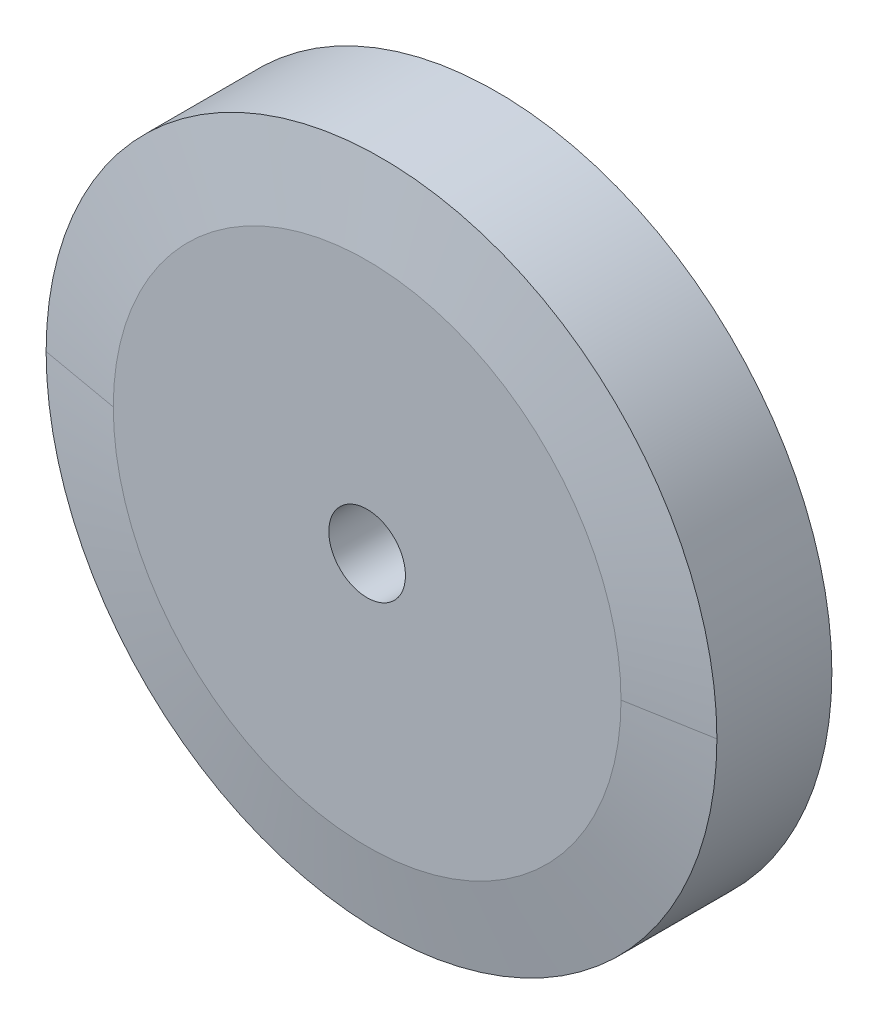
ISO-10303-21;
HEADER;
FILE_DESCRIPTION(('STEP AP214'),'2;1');
FILE_NAME('part.step','',(''),(''),'','','');
FILE_SCHEMA(('AUTOMOTIVE_DESIGN { 1 0 10303 214 1 1 1 1 }'));
ENDSEC;
DATA;
#1=APPLICATION_CONTEXT('core data for automotive mechanical design processes');
#2=APPLICATION_PROTOCOL_DEFINITION('international standard','automotive_design',2000,#1);
#3=PRODUCT_CONTEXT('',#1,'mechanical');
#4=PRODUCT('Part','Part','',(#3));
#5=PRODUCT_RELATED_PRODUCT_CATEGORY('part','',(#4));
#6=PRODUCT_DEFINITION_FORMATION('','',#4);
#7=PRODUCT_DEFINITION_CONTEXT('part definition',#1,'design');
#8=PRODUCT_DEFINITION('design','',#6,#7);
#9=PRODUCT_DEFINITION_SHAPE('','',#8);
#10=(LENGTH_UNIT() NAMED_UNIT(*) SI_UNIT(.MILLI.,.METRE.));
#11=(NAMED_UNIT(*) PLANE_ANGLE_UNIT() SI_UNIT($,.RADIAN.));
#12=(NAMED_UNIT(*) SI_UNIT($,.STERADIAN.) SOLID_ANGLE_UNIT());
#13=UNCERTAINTY_MEASURE_WITH_UNIT(LENGTH_MEASURE(1.E-05),#10,'distance_accuracy_value','');
#14=(GEOMETRIC_REPRESENTATION_CONTEXT(3) GLOBAL_UNCERTAINTY_ASSIGNED_CONTEXT((#13)) GLOBAL_UNIT_ASSIGNED_CONTEXT((#10,
#11,#12)) REPRESENTATION_CONTEXT('',''));
#15=CARTESIAN_POINT('',(0.,0.,0.));
#16=DIRECTION('',(0.,0.,1.));
#17=DIRECTION('',(1.,0.,0.));
#18=AXIS2_PLACEMENT_3D('',#15,#16,#17);
#19=CARTESIAN_POINT('',(0.,0.,15.));
#20=DIRECTION('',(0.,0.,-1.));
#21=DIRECTION('',(-1.,0.,0.));
#22=AXIS2_PLACEMENT_3D('',#19,#20,#21);
#23=CYLINDRICAL_SURFACE('',#22,35.);
#24=CARTESIAN_POINT('',(0.,0.,13.5));
#25=DIRECTION('',(0.,0.,-1.));
#26=DIRECTION('',(-1.,0.,0.));
#27=AXIS2_PLACEMENT_3D('',#24,#25,#26);
#28=CIRCLE('',#27,35.);
#29=CARTESIAN_POINT('',(-35.,0.,13.5));
#30=VERTEX_POINT('',#29);
#31=CARTESIAN_POINT('',(35.,0.,13.5));
#32=VERTEX_POINT('',#31);
#33=EDGE_CURVE('E81',#30,#32,#28,.T.);
#34=ORIENTED_EDGE('',*,*,#33,.T.);
#35=CARTESIAN_POINT('',(0.,0.,13.5));
#36=DIRECTION('',(0.,0.,-1.));
#37=DIRECTION('',(1.,0.,0.));
#38=AXIS2_PLACEMENT_3D('',#35,#36,#37);
#39=CIRCLE('',#38,35.);
#40=EDGE_CURVE('E90',#32,#30,#39,.T.);
#41=ORIENTED_EDGE('',*,*,#40,.T.);
#42=EDGE_LOOP('',(#34,#41));
#43=FACE_BOUND('',#42,.T.);
#44=CARTESIAN_POINT('',(0.,0.,1.5));
#45=DIRECTION('',(0.,0.,-1.));
#46=DIRECTION('',(-1.,0.,0.));
#47=AXIS2_PLACEMENT_3D('',#44,#45,#46);
#48=CIRCLE('',#47,35.);
#49=CARTESIAN_POINT('',(-35.,0.,1.5));
#50=VERTEX_POINT('',#49);
#51=CARTESIAN_POINT('',(35.,0.,1.5));
#52=VERTEX_POINT('',#51);
#53=EDGE_CURVE('E107',#50,#52,#48,.T.);
#54=ORIENTED_EDGE('',*,*,#53,.F.);
#55=CARTESIAN_POINT('',(0.,0.,1.5));
#56=DIRECTION('',(0.,0.,-1.));
#57=DIRECTION('',(1.,0.,0.));
#58=AXIS2_PLACEMENT_3D('',#55,#56,#57);
#59=CIRCLE('',#58,35.);
#60=EDGE_CURVE('E112',#52,#50,#59,.T.);
#61=ORIENTED_EDGE('',*,*,#60,.F.);
#62=EDGE_LOOP('',(#54,#61));
#63=FACE_BOUND('',#62,.T.);
#64=ADVANCED_FACE('F43',(#43,#63),#23,.T.);
#65=CARTESIAN_POINT('',(0.,0.,15.));
#66=DIRECTION('',(0.,0.,1.));
#67=DIRECTION('',(1.,0.,0.));
#68=AXIS2_PLACEMENT_3D('',#65,#66,#67);
#69=PLANE('',#68);
#70=CARTESIAN_POINT('',(0.,0.,15.));
#71=DIRECTION('',(0.,0.,-1.));
#72=DIRECTION('',(1.,0.,0.));
#73=AXIS2_PLACEMENT_3D('',#70,#71,#72);
#74=CIRCLE('',#73,26.4930772705736);
#75=CARTESIAN_POINT('',(26.4930772705736,0.,15.));
#76=VERTEX_POINT('',#75);
#77=CARTESIAN_POINT('',(-26.4930772705736,0.,15.));
#78=VERTEX_POINT('',#77);
#79=EDGE_CURVE('E92',#76,#78,#74,.T.);
#80=ORIENTED_EDGE('',*,*,#79,.F.);
#81=CARTESIAN_POINT('',(0.,0.,15.));
#82=DIRECTION('',(0.,0.,-1.));
#83=DIRECTION('',(-1.,0.,0.));
#84=AXIS2_PLACEMENT_3D('',#81,#82,#83);
#85=CIRCLE('',#84,26.4930772705736);
#86=EDGE_CURVE('E86',#78,#76,#85,.T.);
#87=ORIENTED_EDGE('',*,*,#86,.F.);
#88=EDGE_LOOP('',(#80,#87));
#89=FACE_BOUND('',#88,.T.);
#90=CARTESIAN_POINT('',(0.,0.,15.));
#91=DIRECTION('',(0.,0.,1.));
#92=DIRECTION('',(1.,0.,0.));
#93=AXIS2_PLACEMENT_3D('',#90,#91,#92);
#94=CIRCLE('',#93,4.);
#95=CARTESIAN_POINT('',(4.,0.,15.));
#96=VERTEX_POINT('',#95);
#97=EDGE_CURVE('E51',#96,#96,#94,.T.);
#98=ORIENTED_EDGE('',*,*,#97,.F.);
#99=EDGE_LOOP('',(#98));
#100=FACE_BOUND('',#99,.T.);
#101=ADVANCED_FACE('F135',(#89,#100),#69,.T.);
#102=CARTESIAN_POINT('',(0.,0.,0.));
#103=DIRECTION('',(0.,0.,1.));
#104=DIRECTION('',(1.,0.,0.));
#105=AXIS2_PLACEMENT_3D('',#102,#103,#104);
#106=PLANE('',#105);
#107=CARTESIAN_POINT('',(0.,0.,0.));
#108=DIRECTION('',(0.,0.,-1.));
#109=DIRECTION('',(-1.,0.,0.));
#110=AXIS2_PLACEMENT_3D('',#107,#108,#109);
#111=CIRCLE('',#110,26.4930772705737);
#112=CARTESIAN_POINT('',(-26.4930772705737,0.,0.));
#113=VERTEX_POINT('',#112);
#114=CARTESIAN_POINT('',(26.4930772705737,0.,0.));
#115=VERTEX_POINT('',#114);
#116=EDGE_CURVE('E117',#113,#115,#111,.T.);
#117=ORIENTED_EDGE('',*,*,#116,.T.);
#118=CARTESIAN_POINT('',(0.,0.,0.));
#119=DIRECTION('',(0.,0.,-1.));
#120=DIRECTION('',(1.,0.,0.));
#121=AXIS2_PLACEMENT_3D('',#118,#119,#120);
#122=CIRCLE('',#121,26.4930772705737);
#123=EDGE_CURVE('E116',#115,#113,#122,.T.);
#124=ORIENTED_EDGE('',*,*,#123,.T.);
#125=EDGE_LOOP('',(#117,#124));
#126=FACE_BOUND('',#125,.T.);
#127=CARTESIAN_POINT('',(0.,0.,0.));
#128=DIRECTION('',(0.,0.,1.));
#129=DIRECTION('',(1.,0.,0.));
#130=AXIS2_PLACEMENT_3D('',#127,#128,#129);
#131=CIRCLE('',#130,4.);
#132=CARTESIAN_POINT('',(4.,0.,0.));
#133=VERTEX_POINT('',#132);
#134=EDGE_CURVE('E11',#133,#133,#131,.T.);
#135=ORIENTED_EDGE('',*,*,#134,.T.);
#136=EDGE_LOOP('',(#135));
#137=FACE_BOUND('',#136,.T.);
#138=ADVANCED_FACE('F137',(#126,#137),#106,.F.);
#139=CARTESIAN_POINT('',(0.,0.,-5.));
#140=DIRECTION('',(0.,0.,1.));
#141=DIRECTION('',(1.,0.,0.));
#142=AXIS2_PLACEMENT_3D('',#139,#140,#141);
#143=CYLINDRICAL_SURFACE('',#142,4.);
#144=ORIENTED_EDGE('',*,*,#97,.T.);
#145=EDGE_LOOP('',(#144));
#146=FACE_BOUND('',#145,.T.);
#147=ORIENTED_EDGE('',*,*,#134,.F.);
#148=EDGE_LOOP('',(#147));
#149=FACE_BOUND('',#148,.T.);
#150=ADVANCED_FACE('F132',(#146,#149),#143,.F.);
#151=CARTESIAN_POINT('',(0.,0.,1.5));
#152=DIRECTION('',(0.,0.,1.));
#153=DIRECTION('',(1.,0.,0.));
#154=AXIS2_PLACEMENT_3D('',#151,#152,#153);
#155=CONICAL_SURFACE('',#154,35.,1.39626340159546);
#156=ORIENTED_EDGE('',*,*,#60,.T.);
#157=DIRECTION('',(0.984807753012207,0.,-0.173648177666935));
#158=VECTOR('',#157,1.);
#159=CARTESIAN_POINT('',(-35.,0.,1.5));
#160=LINE('',#159,#158);
#161=EDGE_CURVE('E101',#50,#113,#160,.T.);
#162=ORIENTED_EDGE('',*,*,#161,.T.);
#163=ORIENTED_EDGE('',*,*,#123,.F.);
#164=DIRECTION('',(-0.984807753012207,0.,-0.173648177666935));
#165=VECTOR('',#164,1.);
#166=CARTESIAN_POINT('',(35.,0.,1.5));
#167=LINE('',#166,#165);
#168=EDGE_CURVE('E111',#52,#115,#167,.T.);
#169=ORIENTED_EDGE('',*,*,#168,.F.);
#170=EDGE_LOOP('',(#156,#162,#163,#169));
#171=FACE_BOUND('',#170,.T.);
#172=ADVANCED_FACE('F148',(#171),#155,.T.);
#173=CARTESIAN_POINT('',(0.,0.,1.5));
#174=DIRECTION('',(0.,0.,1.));
#175=DIRECTION('',(1.,0.,0.));
#176=AXIS2_PLACEMENT_3D('',#173,#174,#175);
#177=CONICAL_SURFACE('',#176,35.,1.39626340159546);
#178=ORIENTED_EDGE('',*,*,#116,.F.);
#179=ORIENTED_EDGE('',*,*,#161,.F.);
#180=ORIENTED_EDGE('',*,*,#53,.T.);
#181=ORIENTED_EDGE('',*,*,#168,.T.);
#182=EDGE_LOOP('',(#178,#179,#180,#181));
#183=FACE_BOUND('',#182,.T.);
#184=ADVANCED_FACE('F151',(#183),#177,.T.);
#185=CARTESIAN_POINT('',(0.,0.,15.));
#186=DIRECTION('',(0.,0.,-1.));
#187=DIRECTION('',(-1.,0.,0.));
#188=AXIS2_PLACEMENT_3D('',#185,#186,#187);
#189=CONICAL_SURFACE('',#188,26.4930772705736,1.39626340159546);
#190=ORIENTED_EDGE('',*,*,#79,.T.);
#191=DIRECTION('',(-0.984807753012207,0.,-0.173648177666934));
#192=VECTOR('',#191,1.);
#193=CARTESIAN_POINT('',(-26.4930772705736,0.,15.));
#194=LINE('',#193,#192);
#195=EDGE_CURVE('E63',#78,#30,#194,.T.);
#196=ORIENTED_EDGE('',*,*,#195,.T.);
#197=ORIENTED_EDGE('',*,*,#40,.F.);
#198=DIRECTION('',(0.984807753012207,0.,-0.173648177666934));
#199=VECTOR('',#198,1.);
#200=CARTESIAN_POINT('',(26.4930772705736,0.,15.));
#201=LINE('',#200,#199);
#202=EDGE_CURVE('E58',#76,#32,#201,.T.);
#203=ORIENTED_EDGE('',*,*,#202,.F.);
#204=EDGE_LOOP('',(#190,#196,#197,#203));
#205=FACE_BOUND('',#204,.T.);
#206=ADVANCED_FACE('F89',(#205),#189,.T.);
#207=CARTESIAN_POINT('',(0.,0.,15.));
#208=DIRECTION('',(0.,0.,-1.));
#209=DIRECTION('',(-1.,0.,0.));
#210=AXIS2_PLACEMENT_3D('',#207,#208,#209);
#211=CONICAL_SURFACE('',#210,26.4930772705736,1.39626340159546);
#212=ORIENTED_EDGE('',*,*,#202,.T.);
#213=ORIENTED_EDGE('',*,*,#33,.F.);
#214=ORIENTED_EDGE('',*,*,#195,.F.);
#215=ORIENTED_EDGE('',*,*,#86,.T.);
#216=EDGE_LOOP('',(#212,#213,#214,#215));
#217=FACE_BOUND('',#216,.T.);
#218=ADVANCED_FACE('F82',(#217),#211,.T.);
#219=CLOSED_SHELL('',(#64,#101,#138,#150,#172,#184,#206,#218));
#220=MANIFOLD_SOLID_BREP('B2',#219);
#221=ADVANCED_BREP_SHAPE_REPRESENTATION('',(#18,#220),#14);
#222=SHAPE_DEFINITION_REPRESENTATION(#9,#221);
ENDSEC;
END-ISO-10303-21;
